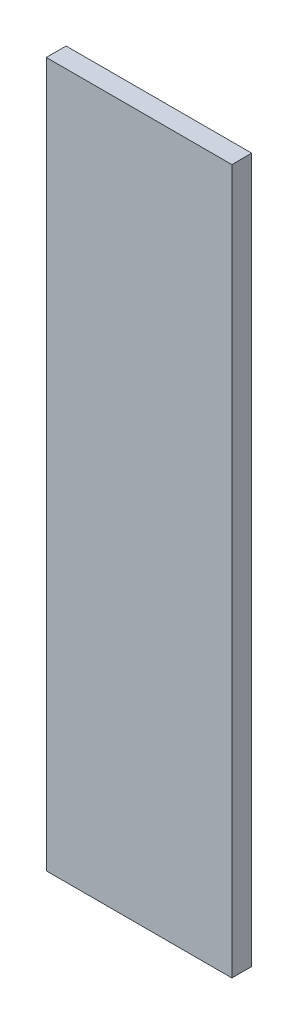
ISO-10303-21;
HEADER;
FILE_DESCRIPTION(('STEP AP214'),'2;1');
FILE_NAME('part.step','',(''),(''),'','','');
FILE_SCHEMA(('AUTOMOTIVE_DESIGN { 1 0 10303 214 1 1 1 1 }'));
ENDSEC;
DATA;
#1=APPLICATION_CONTEXT('core data for automotive mechanical design processes');
#2=APPLICATION_PROTOCOL_DEFINITION('international standard','automotive_design',2000,#1);
#3=PRODUCT_CONTEXT('',#1,'mechanical');
#4=PRODUCT('Part','Part','',(#3));
#5=PRODUCT_RELATED_PRODUCT_CATEGORY('part','',(#4));
#6=PRODUCT_DEFINITION_FORMATION('','',#4);
#7=PRODUCT_DEFINITION_CONTEXT('part definition',#1,'design');
#8=PRODUCT_DEFINITION('design','',#6,#7);
#9=PRODUCT_DEFINITION_SHAPE('','',#8);
#10=(LENGTH_UNIT() NAMED_UNIT(*) SI_UNIT(.MILLI.,.METRE.));
#11=(NAMED_UNIT(*) PLANE_ANGLE_UNIT() SI_UNIT($,.RADIAN.));
#12=(NAMED_UNIT(*) SI_UNIT($,.STERADIAN.) SOLID_ANGLE_UNIT());
#13=UNCERTAINTY_MEASURE_WITH_UNIT(LENGTH_MEASURE(1.E-05),#10,'distance_accuracy_value','');
#14=(GEOMETRIC_REPRESENTATION_CONTEXT(3) GLOBAL_UNCERTAINTY_ASSIGNED_CONTEXT((#13)) GLOBAL_UNIT_ASSIGNED_CONTEXT((#10,
#11,#12)) REPRESENTATION_CONTEXT('',''));
#15=CARTESIAN_POINT('',(0.,0.,0.));
#16=DIRECTION('',(0.,0.,1.));
#17=DIRECTION('',(1.,0.,0.));
#18=AXIS2_PLACEMENT_3D('',#15,#16,#17);
#19=CARTESIAN_POINT('',(12.7,-36.5,18.));
#20=DIRECTION('',(1.,0.,0.));
#21=DIRECTION('',(0.,1.,0.));
#22=AXIS2_PLACEMENT_3D('',#19,#20,#21);
#23=PLANE('',#22);
#24=DIRECTION('',(0.,-1.,0.));
#25=VECTOR('',#24,1.);
#26=CARTESIAN_POINT('',(12.7,-36.5,0.));
#27=LINE('',#26,#25);
#28=CARTESIAN_POINT('',(12.7,603.5,0.));
#29=VERTEX_POINT('',#28);
#30=CARTESIAN_POINT('',(12.7,-36.5,0.));
#31=VERTEX_POINT('',#30);
#32=EDGE_CURVE('E96',#29,#31,#27,.T.);
#33=ORIENTED_EDGE('',*,*,#32,.T.);
#34=DIRECTION('',(0.,0.,-1.));
#35=VECTOR('',#34,1.);
#36=CARTESIAN_POINT('',(12.7,-36.5,18.));
#37=LINE('',#36,#35);
#38=CARTESIAN_POINT('',(12.7,-36.5,18.));
#39=VERTEX_POINT('',#38);
#40=EDGE_CURVE('E11',#39,#31,#37,.T.);
#41=ORIENTED_EDGE('',*,*,#40,.F.);
#42=DIRECTION('',(0.,-1.,0.));
#43=VECTOR('',#42,1.);
#44=CARTESIAN_POINT('',(12.7,-36.5,18.));
#45=LINE('',#44,#43);
#46=CARTESIAN_POINT('',(12.7,603.5,18.));
#47=VERTEX_POINT('',#46);
#48=EDGE_CURVE('E84',#47,#39,#45,.T.);
#49=ORIENTED_EDGE('',*,*,#48,.F.);
#50=DIRECTION('',(0.,0.,-1.));
#51=VECTOR('',#50,1.);
#52=CARTESIAN_POINT('',(12.7,603.5,18.));
#53=LINE('',#52,#51);
#54=EDGE_CURVE('E92',#47,#29,#53,.T.);
#55=ORIENTED_EDGE('',*,*,#54,.T.);
#56=EDGE_LOOP('',(#33,#41,#49,#55));
#57=FACE_BOUND('',#56,.T.);
#58=ADVANCED_FACE('F33',(#57),#23,.F.);
#59=CARTESIAN_POINT('',(12.7,-36.5,18.));
#60=DIRECTION('',(0.,1.,0.));
#61=DIRECTION('',(0.,0.,1.));
#62=AXIS2_PLACEMENT_3D('',#59,#60,#61);
#63=PLANE('',#62);
#64=DIRECTION('',(1.,0.,0.));
#65=VECTOR('',#64,1.);
#66=CARTESIAN_POINT('',(12.7,-36.5,0.));
#67=LINE('',#66,#65);
#68=CARTESIAN_POINT('',(181.3,-36.5,0.));
#69=VERTEX_POINT('',#68);
#70=EDGE_CURVE('E88',#31,#69,#67,.T.);
#71=ORIENTED_EDGE('',*,*,#70,.T.);
#72=DIRECTION('',(0.,0.,-1.));
#73=VECTOR('',#72,1.);
#74=CARTESIAN_POINT('',(181.3,-36.5,18.));
#75=LINE('',#74,#73);
#76=CARTESIAN_POINT('',(181.3,-36.5,18.));
#77=VERTEX_POINT('',#76);
#78=EDGE_CURVE('E41',#77,#69,#75,.T.);
#79=ORIENTED_EDGE('',*,*,#78,.F.);
#80=DIRECTION('',(1.,0.,0.));
#81=VECTOR('',#80,1.);
#82=CARTESIAN_POINT('',(12.7,-36.5,18.));
#83=LINE('',#82,#81);
#84=EDGE_CURVE('E79',#39,#77,#83,.T.);
#85=ORIENTED_EDGE('',*,*,#84,.F.);
#86=ORIENTED_EDGE('',*,*,#40,.T.);
#87=EDGE_LOOP('',(#71,#79,#85,#86));
#88=FACE_BOUND('',#87,.T.);
#89=ADVANCED_FACE('F87',(#88),#63,.F.);
#90=CARTESIAN_POINT('',(181.3,-36.5,18.));
#91=DIRECTION('',(-1.,0.,0.));
#92=DIRECTION('',(0.,0.,1.));
#93=AXIS2_PLACEMENT_3D('',#90,#91,#92);
#94=PLANE('',#93);
#95=DIRECTION('',(0.,1.,0.));
#96=VECTOR('',#95,1.);
#97=CARTESIAN_POINT('',(181.3,-36.5,0.));
#98=LINE('',#97,#96);
#99=CARTESIAN_POINT('',(181.3,603.5,0.));
#100=VERTEX_POINT('',#99);
#101=EDGE_CURVE('E66',#69,#100,#98,.T.);
#102=ORIENTED_EDGE('',*,*,#101,.T.);
#103=DIRECTION('',(0.,0.,-1.));
#104=VECTOR('',#103,1.);
#105=CARTESIAN_POINT('',(181.3,603.5,18.));
#106=LINE('',#105,#104);
#107=CARTESIAN_POINT('',(181.3,603.5,18.));
#108=VERTEX_POINT('',#107);
#109=EDGE_CURVE('E89',#108,#100,#106,.T.);
#110=ORIENTED_EDGE('',*,*,#109,.F.);
#111=DIRECTION('',(0.,1.,0.));
#112=VECTOR('',#111,1.);
#113=CARTESIAN_POINT('',(181.3,-36.5,18.));
#114=LINE('',#113,#112);
#115=EDGE_CURVE('E82',#77,#108,#114,.T.);
#116=ORIENTED_EDGE('',*,*,#115,.F.);
#117=ORIENTED_EDGE('',*,*,#78,.T.);
#118=EDGE_LOOP('',(#102,#110,#116,#117));
#119=FACE_BOUND('',#118,.T.);
#120=ADVANCED_FACE('F90',(#119),#94,.F.);
#121=CARTESIAN_POINT('',(12.7,603.5,18.));
#122=DIRECTION('',(0.,-1.,0.));
#123=DIRECTION('',(0.,0.,-1.));
#124=AXIS2_PLACEMENT_3D('',#121,#122,#123);
#125=PLANE('',#124);
#126=DIRECTION('',(-1.,0.,0.));
#127=VECTOR('',#126,1.);
#128=CARTESIAN_POINT('',(12.7,603.5,0.));
#129=LINE('',#128,#127);
#130=EDGE_CURVE('E72',#100,#29,#129,.T.);
#131=ORIENTED_EDGE('',*,*,#130,.T.);
#132=ORIENTED_EDGE('',*,*,#54,.F.);
#133=DIRECTION('',(-1.,0.,0.));
#134=VECTOR('',#133,1.);
#135=CARTESIAN_POINT('',(12.7,603.5,18.));
#136=LINE('',#135,#134);
#137=EDGE_CURVE('E49',#108,#47,#136,.T.);
#138=ORIENTED_EDGE('',*,*,#137,.F.);
#139=ORIENTED_EDGE('',*,*,#109,.T.);
#140=EDGE_LOOP('',(#131,#132,#138,#139));
#141=FACE_BOUND('',#140,.T.);
#142=ADVANCED_FACE('F103',(#141),#125,.F.);
#143=CARTESIAN_POINT('',(0.,0.,18.));
#144=DIRECTION('',(0.,0.,-1.));
#145=DIRECTION('',(-1.,0.,0.));
#146=AXIS2_PLACEMENT_3D('',#143,#144,#145);
#147=PLANE('',#146);
#148=ORIENTED_EDGE('',*,*,#48,.T.);
#149=ORIENTED_EDGE('',*,*,#84,.T.);
#150=ORIENTED_EDGE('',*,*,#115,.T.);
#151=ORIENTED_EDGE('',*,*,#137,.T.);
#152=EDGE_LOOP('',(#148,#149,#150,#151));
#153=FACE_BOUND('',#152,.T.);
#154=ADVANCED_FACE('F80',(#153),#147,.F.);
#155=CARTESIAN_POINT('',(0.,0.,0.));
#156=DIRECTION('',(0.,0.,-1.));
#157=DIRECTION('',(-1.,0.,0.));
#158=AXIS2_PLACEMENT_3D('',#155,#156,#157);
#159=PLANE('',#158);
#160=ORIENTED_EDGE('',*,*,#32,.F.);
#161=ORIENTED_EDGE('',*,*,#130,.F.);
#162=ORIENTED_EDGE('',*,*,#101,.F.);
#163=ORIENTED_EDGE('',*,*,#70,.F.);
#164=EDGE_LOOP('',(#160,#161,#162,#163));
#165=FACE_BOUND('',#164,.T.);
#166=ADVANCED_FACE('F106',(#165),#159,.T.);
#167=CLOSED_SHELL('',(#58,#89,#120,#142,#154,#166));
#168=MANIFOLD_SOLID_BREP('B2',#167);
#169=ADVANCED_BREP_SHAPE_REPRESENTATION('',(#18,#168),#14);
#170=SHAPE_DEFINITION_REPRESENTATION(#9,#169);
ENDSEC;
END-ISO-10303-21;
